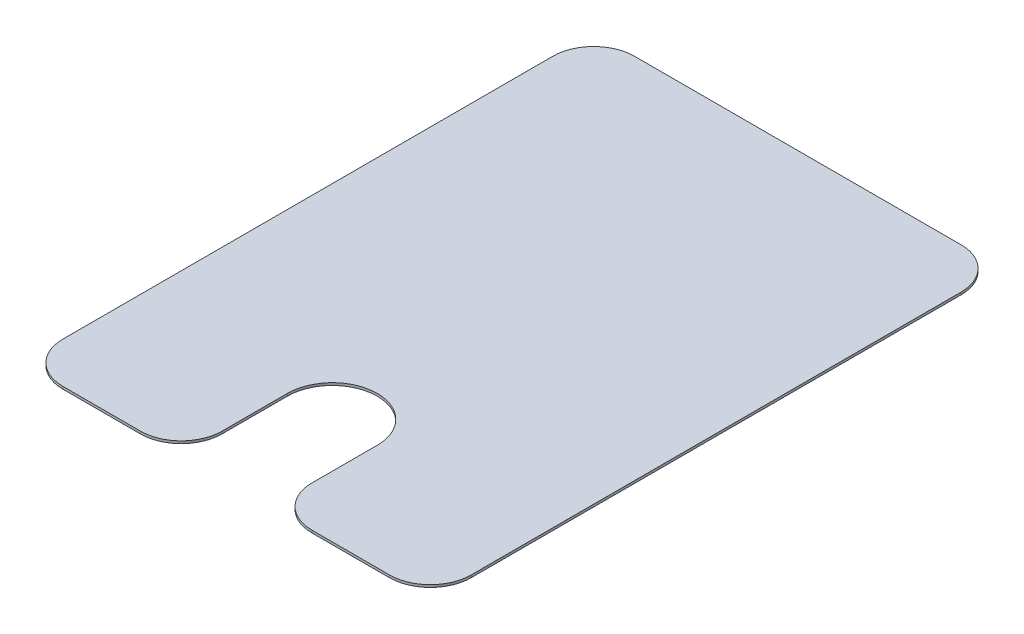
ISO-10303-21;
HEADER;
FILE_DESCRIPTION(('STEP AP214'),'2;1');
FILE_NAME('part.step','',(''),(''),'','','');
FILE_SCHEMA(('AUTOMOTIVE_DESIGN { 1 0 10303 214 1 1 1 1 }'));
ENDSEC;
DATA;
#1=APPLICATION_CONTEXT('core data for automotive mechanical design processes');
#2=APPLICATION_PROTOCOL_DEFINITION('international standard','automotive_design',2000,#1);
#3=PRODUCT_CONTEXT('',#1,'mechanical');
#4=PRODUCT('Part','Part','',(#3));
#5=PRODUCT_RELATED_PRODUCT_CATEGORY('part','',(#4));
#6=PRODUCT_DEFINITION_FORMATION('','',#4);
#7=PRODUCT_DEFINITION_CONTEXT('part definition',#1,'design');
#8=PRODUCT_DEFINITION('design','',#6,#7);
#9=PRODUCT_DEFINITION_SHAPE('','',#8);
#10=(LENGTH_UNIT() NAMED_UNIT(*) SI_UNIT(.MILLI.,.METRE.));
#11=(NAMED_UNIT(*) PLANE_ANGLE_UNIT() SI_UNIT($,.RADIAN.));
#12=(NAMED_UNIT(*) SI_UNIT($,.STERADIAN.) SOLID_ANGLE_UNIT());
#13=UNCERTAINTY_MEASURE_WITH_UNIT(LENGTH_MEASURE(1.E-05),#10,'distance_accuracy_value','');
#14=(GEOMETRIC_REPRESENTATION_CONTEXT(3) GLOBAL_UNCERTAINTY_ASSIGNED_CONTEXT((#13)) GLOBAL_UNIT_ASSIGNED_CONTEXT((#10,
#11,#12)) REPRESENTATION_CONTEXT('',''));
#15=CARTESIAN_POINT('',(0.,0.,0.));
#16=DIRECTION('',(0.,0.,1.));
#17=DIRECTION('',(1.,0.,0.));
#18=AXIS2_PLACEMENT_3D('',#15,#16,#17);
#19=CARTESIAN_POINT('',(200.,3.,300.));
#20=DIRECTION('',(0.,-1.,0.));
#21=DIRECTION('',(0.,0.,-1.));
#22=AXIS2_PLACEMENT_3D('',#19,#20,#21);
#23=CYLINDRICAL_SURFACE('',#22,50.);
#24=CARTESIAN_POINT('',(200.,0.,300.));
#25=DIRECTION('',(0.,1.,0.));
#26=DIRECTION('',(0.,0.,1.));
#27=AXIS2_PLACEMENT_3D('',#24,#25,#26);
#28=CIRCLE('',#27,50.);
#29=CARTESIAN_POINT('',(200.,0.,350.));
#30=VERTEX_POINT('',#29);
#31=CARTESIAN_POINT('',(250.,0.,300.));
#32=VERTEX_POINT('',#31);
#33=EDGE_CURVE('E180',#30,#32,#28,.T.);
#34=ORIENTED_EDGE('',*,*,#33,.T.);
#35=DIRECTION('',(0.,-1.,0.));
#36=VECTOR('',#35,1.);
#37=CARTESIAN_POINT('',(250.,3.,300.));
#38=LINE('',#37,#36);
#39=CARTESIAN_POINT('',(250.,3.,300.));
#40=VERTEX_POINT('',#39);
#41=EDGE_CURVE('E11',#40,#32,#38,.T.);
#42=ORIENTED_EDGE('',*,*,#41,.F.);
#43=CARTESIAN_POINT('',(200.,3.,300.));
#44=DIRECTION('',(0.,1.,0.));
#45=DIRECTION('',(0.,0.,1.));
#46=AXIS2_PLACEMENT_3D('',#43,#44,#45);
#47=CIRCLE('',#46,50.);
#48=CARTESIAN_POINT('',(200.,3.,350.));
#49=VERTEX_POINT('',#48);
#50=EDGE_CURVE('E220',#49,#40,#47,.T.);
#51=ORIENTED_EDGE('',*,*,#50,.F.);
#52=DIRECTION('',(0.,-1.,0.));
#53=VECTOR('',#52,1.);
#54=CARTESIAN_POINT('',(200.,3.,350.));
#55=LINE('',#54,#53);
#56=EDGE_CURVE('E176',#49,#30,#55,.T.);
#57=ORIENTED_EDGE('',*,*,#56,.T.);
#58=EDGE_LOOP('',(#34,#42,#51,#57));
#59=FACE_BOUND('',#58,.T.);
#60=ADVANCED_FACE('F43',(#59),#23,.T.);
#61=CARTESIAN_POINT('',(250.,3.,300.));
#62=DIRECTION('',(-1.,0.,0.));
#63=DIRECTION('',(0.,0.,1.));
#64=AXIS2_PLACEMENT_3D('',#61,#62,#63);
#65=PLANE('',#64);
#66=DIRECTION('',(0.,0.,-1.));
#67=VECTOR('',#66,1.);
#68=CARTESIAN_POINT('',(250.,0.,300.));
#69=LINE('',#68,#67);
#70=CARTESIAN_POINT('',(250.,0.,-300.));
#71=VERTEX_POINT('',#70);
#72=EDGE_CURVE('E184',#32,#71,#69,.T.);
#73=ORIENTED_EDGE('',*,*,#72,.T.);
#74=DIRECTION('',(0.,-1.,0.));
#75=VECTOR('',#74,1.);
#76=CARTESIAN_POINT('',(250.,3.,-300.));
#77=LINE('',#76,#75);
#78=CARTESIAN_POINT('',(250.,3.,-300.));
#79=VERTEX_POINT('',#78);
#80=EDGE_CURVE('E52',#79,#71,#77,.T.);
#81=ORIENTED_EDGE('',*,*,#80,.F.);
#82=DIRECTION('',(0.,0.,-1.));
#83=VECTOR('',#82,1.);
#84=CARTESIAN_POINT('',(250.,3.,300.));
#85=LINE('',#84,#83);
#86=EDGE_CURVE('E121',#40,#79,#85,.T.);
#87=ORIENTED_EDGE('',*,*,#86,.F.);
#88=ORIENTED_EDGE('',*,*,#41,.T.);
#89=EDGE_LOOP('',(#73,#81,#87,#88));
#90=FACE_BOUND('',#89,.T.);
#91=ADVANCED_FACE('F328',(#90),#65,.F.);
#92=CARTESIAN_POINT('',(200.,3.,-300.));
#93=DIRECTION('',(0.,-1.,0.));
#94=DIRECTION('',(0.,0.,-1.));
#95=AXIS2_PLACEMENT_3D('',#92,#93,#94);
#96=CYLINDRICAL_SURFACE('',#95,50.);
#97=CARTESIAN_POINT('',(200.,0.,-300.));
#98=DIRECTION('',(0.,1.,0.));
#99=DIRECTION('',(0.,0.,-1.));
#100=AXIS2_PLACEMENT_3D('',#97,#98,#99);
#101=CIRCLE('',#100,50.);
#102=CARTESIAN_POINT('',(200.,0.,-350.));
#103=VERTEX_POINT('',#102);
#104=EDGE_CURVE('E187',#71,#103,#101,.T.);
#105=ORIENTED_EDGE('',*,*,#104,.T.);
#106=DIRECTION('',(0.,-1.,0.));
#107=VECTOR('',#106,1.);
#108=CARTESIAN_POINT('',(200.,3.,-350.));
#109=LINE('',#108,#107);
#110=CARTESIAN_POINT('',(200.,3.,-350.));
#111=VERTEX_POINT('',#110);
#112=EDGE_CURVE('E255',#111,#103,#109,.T.);
#113=ORIENTED_EDGE('',*,*,#112,.F.);
#114=CARTESIAN_POINT('',(200.,3.,-300.));
#115=DIRECTION('',(0.,1.,0.));
#116=DIRECTION('',(0.,0.,-1.));
#117=AXIS2_PLACEMENT_3D('',#114,#115,#116);
#118=CIRCLE('',#117,50.);
#119=EDGE_CURVE('E265',#79,#111,#118,.T.);
#120=ORIENTED_EDGE('',*,*,#119,.F.);
#121=ORIENTED_EDGE('',*,*,#80,.T.);
#122=EDGE_LOOP('',(#105,#113,#120,#121));
#123=FACE_BOUND('',#122,.T.);
#124=ADVANCED_FACE('F263',(#123),#96,.T.);
#125=CARTESIAN_POINT('',(-200.,3.,-350.));
#126=DIRECTION('',(0.,0.,1.));
#127=DIRECTION('',(1.,0.,0.));
#128=AXIS2_PLACEMENT_3D('',#125,#126,#127);
#129=PLANE('',#128);
#130=DIRECTION('',(-1.,0.,0.));
#131=VECTOR('',#130,1.);
#132=CARTESIAN_POINT('',(-200.,0.,-350.));
#133=LINE('',#132,#131);
#134=CARTESIAN_POINT('',(-200.,0.,-350.));
#135=VERTEX_POINT('',#134);
#136=EDGE_CURVE('E190',#103,#135,#133,.T.);
#137=ORIENTED_EDGE('',*,*,#136,.T.);
#138=DIRECTION('',(0.,-1.,0.));
#139=VECTOR('',#138,1.);
#140=CARTESIAN_POINT('',(-200.,3.,-350.));
#141=LINE('',#140,#139);
#142=CARTESIAN_POINT('',(-200.,3.,-350.));
#143=VERTEX_POINT('',#142);
#144=EDGE_CURVE('E251',#143,#135,#141,.T.);
#145=ORIENTED_EDGE('',*,*,#144,.F.);
#146=DIRECTION('',(-1.,0.,0.));
#147=VECTOR('',#146,1.);
#148=CARTESIAN_POINT('',(-200.,3.,-350.));
#149=LINE('',#148,#147);
#150=EDGE_CURVE('E284',#111,#143,#149,.T.);
#151=ORIENTED_EDGE('',*,*,#150,.F.);
#152=ORIENTED_EDGE('',*,*,#112,.T.);
#153=EDGE_LOOP('',(#137,#145,#151,#152));
#154=FACE_BOUND('',#153,.T.);
#155=ADVANCED_FACE('F274',(#154),#129,.F.);
#156=CARTESIAN_POINT('',(-200.,3.,-300.));
#157=DIRECTION('',(0.,-1.,0.));
#158=DIRECTION('',(0.,0.,-1.));
#159=AXIS2_PLACEMENT_3D('',#156,#157,#158);
#160=CYLINDRICAL_SURFACE('',#159,50.);
#161=CARTESIAN_POINT('',(-200.,0.,-300.));
#162=DIRECTION('',(0.,1.,0.));
#163=DIRECTION('',(0.,0.,-1.));
#164=AXIS2_PLACEMENT_3D('',#161,#162,#163);
#165=CIRCLE('',#164,50.);
#166=CARTESIAN_POINT('',(-250.,0.,-300.));
#167=VERTEX_POINT('',#166);
#168=EDGE_CURVE('E193',#135,#167,#165,.T.);
#169=ORIENTED_EDGE('',*,*,#168,.T.);
#170=DIRECTION('',(0.,-1.,0.));
#171=VECTOR('',#170,1.);
#172=CARTESIAN_POINT('',(-250.,3.,-300.));
#173=LINE('',#172,#171);
#174=CARTESIAN_POINT('',(-250.,3.,-300.));
#175=VERTEX_POINT('',#174);
#176=EDGE_CURVE('E247',#175,#167,#173,.T.);
#177=ORIENTED_EDGE('',*,*,#176,.F.);
#178=CARTESIAN_POINT('',(-200.,3.,-300.));
#179=DIRECTION('',(0.,1.,0.));
#180=DIRECTION('',(0.,0.,-1.));
#181=AXIS2_PLACEMENT_3D('',#178,#179,#180);
#182=CIRCLE('',#181,50.);
#183=EDGE_CURVE('E280',#143,#175,#182,.T.);
#184=ORIENTED_EDGE('',*,*,#183,.F.);
#185=ORIENTED_EDGE('',*,*,#144,.T.);
#186=EDGE_LOOP('',(#169,#177,#184,#185));
#187=FACE_BOUND('',#186,.T.);
#188=ADVANCED_FACE('F278',(#187),#160,.T.);
#189=CARTESIAN_POINT('',(-250.,3.,300.));
#190=DIRECTION('',(1.,0.,0.));
#191=DIRECTION('',(0.,0.,-1.));
#192=AXIS2_PLACEMENT_3D('',#189,#190,#191);
#193=PLANE('',#192);
#194=DIRECTION('',(0.,0.,1.));
#195=VECTOR('',#194,1.);
#196=CARTESIAN_POINT('',(-250.,0.,300.));
#197=LINE('',#196,#195);
#198=CARTESIAN_POINT('',(-250.,0.,300.));
#199=VERTEX_POINT('',#198);
#200=EDGE_CURVE('E196',#167,#199,#197,.T.);
#201=ORIENTED_EDGE('',*,*,#200,.T.);
#202=DIRECTION('',(0.,-1.,0.));
#203=VECTOR('',#202,1.);
#204=CARTESIAN_POINT('',(-250.,3.,300.));
#205=LINE('',#204,#203);
#206=CARTESIAN_POINT('',(-250.,3.,300.));
#207=VERTEX_POINT('',#206);
#208=EDGE_CURVE('E243',#207,#199,#205,.T.);
#209=ORIENTED_EDGE('',*,*,#208,.F.);
#210=DIRECTION('',(0.,0.,1.));
#211=VECTOR('',#210,1.);
#212=CARTESIAN_POINT('',(-250.,3.,300.));
#213=LINE('',#212,#211);
#214=EDGE_CURVE('E283',#175,#207,#213,.T.);
#215=ORIENTED_EDGE('',*,*,#214,.F.);
#216=ORIENTED_EDGE('',*,*,#176,.T.);
#217=EDGE_LOOP('',(#201,#209,#215,#216));
#218=FACE_BOUND('',#217,.T.);
#219=ADVANCED_FACE('F341',(#218),#193,.F.);
#220=CARTESIAN_POINT('',(-200.,3.,300.));
#221=DIRECTION('',(0.,-1.,0.));
#222=DIRECTION('',(0.,0.,-1.));
#223=AXIS2_PLACEMENT_3D('',#220,#221,#222);
#224=CYLINDRICAL_SURFACE('',#223,50.);
#225=CARTESIAN_POINT('',(-200.,0.,300.));
#226=DIRECTION('',(0.,1.,0.));
#227=DIRECTION('',(0.,0.,-1.));
#228=AXIS2_PLACEMENT_3D('',#225,#226,#227);
#229=CIRCLE('',#228,50.);
#230=CARTESIAN_POINT('',(-200.,0.,350.));
#231=VERTEX_POINT('',#230);
#232=EDGE_CURVE('E199',#199,#231,#229,.T.);
#233=ORIENTED_EDGE('',*,*,#232,.T.);
#234=DIRECTION('',(0.,-1.,0.));
#235=VECTOR('',#234,1.);
#236=CARTESIAN_POINT('',(-200.,3.,350.));
#237=LINE('',#236,#235);
#238=CARTESIAN_POINT('',(-200.,3.,350.));
#239=VERTEX_POINT('',#238);
#240=EDGE_CURVE('E239',#239,#231,#237,.T.);
#241=ORIENTED_EDGE('',*,*,#240,.F.);
#242=CARTESIAN_POINT('',(-200.,3.,300.));
#243=DIRECTION('',(0.,1.,0.));
#244=DIRECTION('',(0.,0.,-1.));
#245=AXIS2_PLACEMENT_3D('',#242,#243,#244);
#246=CIRCLE('',#245,50.);
#247=EDGE_CURVE('E288',#207,#239,#246,.T.);
#248=ORIENTED_EDGE('',*,*,#247,.F.);
#249=ORIENTED_EDGE('',*,*,#208,.T.);
#250=EDGE_LOOP('',(#233,#241,#248,#249));
#251=FACE_BOUND('',#250,.T.);
#252=ADVANCED_FACE('F344',(#251),#224,.T.);
#253=CARTESIAN_POINT('',(-200.,3.,350.));
#254=DIRECTION('',(0.,0.,-1.));
#255=DIRECTION('',(-1.,0.,0.));
#256=AXIS2_PLACEMENT_3D('',#253,#254,#255);
#257=PLANE('',#256);
#258=DIRECTION('',(1.,0.,0.));
#259=VECTOR('',#258,1.);
#260=CARTESIAN_POINT('',(-200.,0.,350.));
#261=LINE('',#260,#259);
#262=CARTESIAN_POINT('',(-104.999999999997,0.,350.));
#263=VERTEX_POINT('',#262);
#264=EDGE_CURVE('E202',#231,#263,#261,.T.);
#265=ORIENTED_EDGE('',*,*,#264,.T.);
#266=DIRECTION('',(0.,-1.,0.));
#267=VECTOR('',#266,1.);
#268=CARTESIAN_POINT('',(-104.999999999997,3.,350.));
#269=LINE('',#268,#267);
#270=CARTESIAN_POINT('',(-104.999999999997,3.,350.));
#271=VERTEX_POINT('',#270);
#272=EDGE_CURVE('E235',#271,#263,#269,.T.);
#273=ORIENTED_EDGE('',*,*,#272,.F.);
#274=DIRECTION('',(1.,0.,0.));
#275=VECTOR('',#274,1.);
#276=CARTESIAN_POINT('',(-200.,3.,350.));
#277=LINE('',#276,#275);
#278=EDGE_CURVE('E295',#239,#271,#277,.T.);
#279=ORIENTED_EDGE('',*,*,#278,.F.);
#280=ORIENTED_EDGE('',*,*,#240,.T.);
#281=EDGE_LOOP('',(#265,#273,#279,#280));
#282=FACE_BOUND('',#281,.T.);
#283=ADVANCED_FACE('F348',(#282),#257,.F.);
#284=CARTESIAN_POINT('',(-104.999999999996,3.,300.));
#285=DIRECTION('',(0.,-1.,0.));
#286=DIRECTION('',(0.,0.,-1.));
#287=AXIS2_PLACEMENT_3D('',#284,#285,#286);
#288=CYLINDRICAL_SURFACE('',#287,50.);
#289=CARTESIAN_POINT('',(-104.999999999996,0.,300.));
#290=DIRECTION('',(0.,1.,0.));
#291=DIRECTION('',(0.,0.,-1.));
#292=AXIS2_PLACEMENT_3D('',#289,#290,#291);
#293=CIRCLE('',#292,50.);
#294=CARTESIAN_POINT('',(-54.9999999999964,0.,300.));
#295=VERTEX_POINT('',#294);
#296=EDGE_CURVE('E205',#263,#295,#293,.T.);
#297=ORIENTED_EDGE('',*,*,#296,.T.);
#298=DIRECTION('',(0.,-1.,0.));
#299=VECTOR('',#298,1.);
#300=CARTESIAN_POINT('',(-54.9999999999964,3.,300.));
#301=LINE('',#300,#299);
#302=CARTESIAN_POINT('',(-54.9999999999964,3.,300.));
#303=VERTEX_POINT('',#302);
#304=EDGE_CURVE('E231',#303,#295,#301,.T.);
#305=ORIENTED_EDGE('',*,*,#304,.F.);
#306=CARTESIAN_POINT('',(-104.999999999996,3.,300.));
#307=DIRECTION('',(0.,1.,0.));
#308=DIRECTION('',(0.,0.,-1.));
#309=AXIS2_PLACEMENT_3D('',#306,#307,#308);
#310=CIRCLE('',#309,50.);
#311=EDGE_CURVE('E298',#271,#303,#310,.T.);
#312=ORIENTED_EDGE('',*,*,#311,.F.);
#313=ORIENTED_EDGE('',*,*,#272,.T.);
#314=EDGE_LOOP('',(#297,#305,#312,#313));
#315=FACE_BOUND('',#314,.T.);
#316=ADVANCED_FACE('F352',(#315),#288,.T.);
#317=CARTESIAN_POINT('',(-54.9999999999963,3.,220.));
#318=DIRECTION('',(-1.,0.,0.));
#319=DIRECTION('',(0.,0.,1.));
#320=AXIS2_PLACEMENT_3D('',#317,#318,#319);
#321=PLANE('',#320);
#322=DIRECTION('',(0.,0.,-1.));
#323=VECTOR('',#322,1.);
#324=CARTESIAN_POINT('',(-54.9999999999963,0.,220.));
#325=LINE('',#324,#323);
#326=CARTESIAN_POINT('',(-54.9999999999927,0.,220.));
#327=VERTEX_POINT('',#326);
#328=EDGE_CURVE('E208',#295,#327,#325,.T.);
#329=ORIENTED_EDGE('',*,*,#328,.T.);
#330=DIRECTION('',(0.,-1.,0.));
#331=VECTOR('',#330,1.);
#332=CARTESIAN_POINT('',(-54.9999999999927,3.,220.));
#333=LINE('',#332,#331);
#334=CARTESIAN_POINT('',(-54.9999999999927,3.,220.));
#335=VERTEX_POINT('',#334);
#336=EDGE_CURVE('E227',#335,#327,#333,.T.);
#337=ORIENTED_EDGE('',*,*,#336,.F.);
#338=DIRECTION('',(0.,0.,-1.));
#339=VECTOR('',#338,1.);
#340=CARTESIAN_POINT('',(-54.9999999999963,3.,220.));
#341=LINE('',#340,#339);
#342=EDGE_CURVE('E301',#303,#335,#341,.T.);
#343=ORIENTED_EDGE('',*,*,#342,.F.);
#344=ORIENTED_EDGE('',*,*,#304,.T.);
#345=EDGE_LOOP('',(#329,#337,#343,#344));
#346=FACE_BOUND('',#345,.T.);
#347=ADVANCED_FACE('F309',(#346),#321,.F.);
#348=CARTESIAN_POINT('',(3.6498581934552E-12,3.,220.));
#349=DIRECTION('',(0.,-1.,0.));
#350=DIRECTION('',(0.,0.,-1.));
#351=AXIS2_PLACEMENT_3D('',#348,#349,#350);
#352=CYLINDRICAL_SURFACE('',#351,54.9999999999963);
#353=CARTESIAN_POINT('',(3.6498581934552E-12,0.,220.));
#354=DIRECTION('',(0.,-1.,0.));
#355=DIRECTION('',(0.,0.,1.));
#356=AXIS2_PLACEMENT_3D('',#353,#354,#355);
#357=CIRCLE('',#356,54.9999999999963);
#358=CARTESIAN_POINT('',(54.9999999999963,0.,220.));
#359=VERTEX_POINT('',#358);
#360=EDGE_CURVE('E211',#327,#359,#357,.T.);
#361=ORIENTED_EDGE('',*,*,#360,.T.);
#362=DIRECTION('',(0.,-1.,0.));
#363=VECTOR('',#362,1.);
#364=CARTESIAN_POINT('',(54.9999999999963,3.,220.));
#365=LINE('',#364,#363);
#366=CARTESIAN_POINT('',(54.9999999999963,3.,220.));
#367=VERTEX_POINT('',#366);
#368=EDGE_CURVE('E169',#367,#359,#365,.T.);
#369=ORIENTED_EDGE('',*,*,#368,.F.);
#370=CARTESIAN_POINT('',(3.6498581934552E-12,3.,220.));
#371=DIRECTION('',(0.,-1.,0.));
#372=DIRECTION('',(0.,0.,1.));
#373=AXIS2_PLACEMENT_3D('',#370,#371,#372);
#374=CIRCLE('',#373,54.9999999999963);
#375=EDGE_CURVE('E158',#335,#367,#374,.T.);
#376=ORIENTED_EDGE('',*,*,#375,.F.);
#377=ORIENTED_EDGE('',*,*,#336,.T.);
#378=EDGE_LOOP('',(#361,#369,#376,#377));
#379=FACE_BOUND('',#378,.T.);
#380=ADVANCED_FACE('F313',(#379),#352,.F.);
#381=CARTESIAN_POINT('',(54.9999999999963,3.,220.));
#382=DIRECTION('',(1.,0.,0.));
#383=DIRECTION('',(0.,0.,-1.));
#384=AXIS2_PLACEMENT_3D('',#381,#382,#383);
#385=PLANE('',#384);
#386=DIRECTION('',(0.,0.,1.));
#387=VECTOR('',#386,1.);
#388=CARTESIAN_POINT('',(54.9999999999963,0.,220.));
#389=LINE('',#388,#387);
#390=CARTESIAN_POINT('',(54.9999999999964,0.,300.));
#391=VERTEX_POINT('',#390);
#392=EDGE_CURVE('E167',#359,#391,#389,.T.);
#393=ORIENTED_EDGE('',*,*,#392,.T.);
#394=DIRECTION('',(0.,-1.,0.));
#395=VECTOR('',#394,1.);
#396=CARTESIAN_POINT('',(54.9999999999964,3.,300.));
#397=LINE('',#396,#395);
#398=CARTESIAN_POINT('',(54.9999999999964,3.,300.));
#399=VERTEX_POINT('',#398);
#400=EDGE_CURVE('E164',#399,#391,#397,.T.);
#401=ORIENTED_EDGE('',*,*,#400,.F.);
#402=DIRECTION('',(0.,0.,1.));
#403=VECTOR('',#402,1.);
#404=CARTESIAN_POINT('',(54.9999999999963,3.,220.));
#405=LINE('',#404,#403);
#406=EDGE_CURVE('E152',#367,#399,#405,.T.);
#407=ORIENTED_EDGE('',*,*,#406,.F.);
#408=ORIENTED_EDGE('',*,*,#368,.T.);
#409=EDGE_LOOP('',(#393,#401,#407,#408));
#410=FACE_BOUND('',#409,.T.);
#411=ADVANCED_FACE('F165',(#410),#385,.F.);
#412=CARTESIAN_POINT('',(104.999999999996,3.,300.));
#413=DIRECTION('',(0.,-1.,0.));
#414=DIRECTION('',(0.,0.,-1.));
#415=AXIS2_PLACEMENT_3D('',#412,#413,#414);
#416=CYLINDRICAL_SURFACE('',#415,50.);
#417=CARTESIAN_POINT('',(104.999999999996,0.,300.));
#418=DIRECTION('',(0.,1.,0.));
#419=DIRECTION('',(0.,0.,-1.));
#420=AXIS2_PLACEMENT_3D('',#417,#418,#419);
#421=CIRCLE('',#420,50.);
#422=CARTESIAN_POINT('',(104.999999999997,0.,350.));
#423=VERTEX_POINT('',#422);
#424=EDGE_CURVE('E107',#391,#423,#421,.T.);
#425=ORIENTED_EDGE('',*,*,#424,.T.);
#426=DIRECTION('',(0.,-1.,0.));
#427=VECTOR('',#426,1.);
#428=CARTESIAN_POINT('',(104.999999999997,3.,350.));
#429=LINE('',#428,#427);
#430=CARTESIAN_POINT('',(104.999999999997,3.,350.));
#431=VERTEX_POINT('',#430);
#432=EDGE_CURVE('E170',#431,#423,#429,.T.);
#433=ORIENTED_EDGE('',*,*,#432,.F.);
#434=CARTESIAN_POINT('',(104.999999999996,3.,300.));
#435=DIRECTION('',(0.,1.,0.));
#436=DIRECTION('',(0.,0.,-1.));
#437=AXIS2_PLACEMENT_3D('',#434,#435,#436);
#438=CIRCLE('',#437,50.);
#439=EDGE_CURVE('E156',#399,#431,#438,.T.);
#440=ORIENTED_EDGE('',*,*,#439,.F.);
#441=ORIENTED_EDGE('',*,*,#400,.T.);
#442=EDGE_LOOP('',(#425,#433,#440,#441));
#443=FACE_BOUND('',#442,.T.);
#444=ADVANCED_FACE('F172',(#443),#416,.T.);
#445=CARTESIAN_POINT('',(104.999999999997,3.,350.));
#446=DIRECTION('',(0.,0.,-1.));
#447=DIRECTION('',(-1.,0.,0.));
#448=AXIS2_PLACEMENT_3D('',#445,#446,#447);
#449=PLANE('',#448);
#450=DIRECTION('',(1.,0.,0.));
#451=VECTOR('',#450,1.);
#452=CARTESIAN_POINT('',(104.999999999997,0.,350.));
#453=LINE('',#452,#451);
#454=EDGE_CURVE('E113',#423,#30,#453,.T.);
#455=ORIENTED_EDGE('',*,*,#454,.T.);
#456=ORIENTED_EDGE('',*,*,#56,.F.);
#457=DIRECTION('',(1.,0.,0.));
#458=VECTOR('',#457,1.);
#459=CARTESIAN_POINT('',(104.999999999997,3.,350.));
#460=LINE('',#459,#458);
#461=EDGE_CURVE('E60',#431,#49,#460,.T.);
#462=ORIENTED_EDGE('',*,*,#461,.F.);
#463=ORIENTED_EDGE('',*,*,#432,.T.);
#464=EDGE_LOOP('',(#455,#456,#462,#463));
#465=FACE_BOUND('',#464,.T.);
#466=ADVANCED_FACE('F317',(#465),#449,.F.);
#467=CARTESIAN_POINT('',(200.,3.,300.));
#468=DIRECTION('',(0.,1.,0.));
#469=DIRECTION('',(0.,0.,1.));
#470=AXIS2_PLACEMENT_3D('',#467,#468,#469);
#471=PLANE('',#470);
#472=ORIENTED_EDGE('',*,*,#50,.T.);
#473=ORIENTED_EDGE('',*,*,#86,.T.);
#474=ORIENTED_EDGE('',*,*,#119,.T.);
#475=ORIENTED_EDGE('',*,*,#150,.T.);
#476=ORIENTED_EDGE('',*,*,#183,.T.);
#477=ORIENTED_EDGE('',*,*,#214,.T.);
#478=ORIENTED_EDGE('',*,*,#247,.T.);
#479=ORIENTED_EDGE('',*,*,#278,.T.);
#480=ORIENTED_EDGE('',*,*,#311,.T.);
#481=ORIENTED_EDGE('',*,*,#342,.T.);
#482=ORIENTED_EDGE('',*,*,#375,.T.);
#483=ORIENTED_EDGE('',*,*,#406,.T.);
#484=ORIENTED_EDGE('',*,*,#439,.T.);
#485=ORIENTED_EDGE('',*,*,#461,.T.);
#486=EDGE_LOOP('',(#472,#473,#474,#475,#476,#477,#478,#479,#480,#481,#482,#483,#484,#485));
#487=FACE_BOUND('',#486,.T.);
#488=ADVANCED_FACE('F154',(#487),#471,.T.);
#489=CARTESIAN_POINT('',(200.,0.,300.));
#490=DIRECTION('',(0.,1.,0.));
#491=DIRECTION('',(0.,0.,1.));
#492=AXIS2_PLACEMENT_3D('',#489,#490,#491);
#493=PLANE('',#492);
#494=ORIENTED_EDGE('',*,*,#33,.F.);
#495=ORIENTED_EDGE('',*,*,#454,.F.);
#496=ORIENTED_EDGE('',*,*,#424,.F.);
#497=ORIENTED_EDGE('',*,*,#392,.F.);
#498=ORIENTED_EDGE('',*,*,#360,.F.);
#499=ORIENTED_EDGE('',*,*,#328,.F.);
#500=ORIENTED_EDGE('',*,*,#296,.F.);
#501=ORIENTED_EDGE('',*,*,#264,.F.);
#502=ORIENTED_EDGE('',*,*,#232,.F.);
#503=ORIENTED_EDGE('',*,*,#200,.F.);
#504=ORIENTED_EDGE('',*,*,#168,.F.);
#505=ORIENTED_EDGE('',*,*,#136,.F.);
#506=ORIENTED_EDGE('',*,*,#104,.F.);
#507=ORIENTED_EDGE('',*,*,#72,.F.);
#508=EDGE_LOOP('',(#494,#495,#496,#497,#498,#499,#500,#501,#502,#503,#504,#505,#506,#507));
#509=FACE_BOUND('',#508,.T.);
#510=ADVANCED_FACE('F269',(#509),#493,.F.);
#511=CLOSED_SHELL('',(#60,#91,#124,#155,#188,#219,#252,#283,#316,#347,#380,#411,#444,#466,#488,#510));
#512=MANIFOLD_SOLID_BREP('B2',#511);
#513=ADVANCED_BREP_SHAPE_REPRESENTATION('',(#18,#512),#14);
#514=SHAPE_DEFINITION_REPRESENTATION(#9,#513);
ENDSEC;
END-ISO-10303-21;
